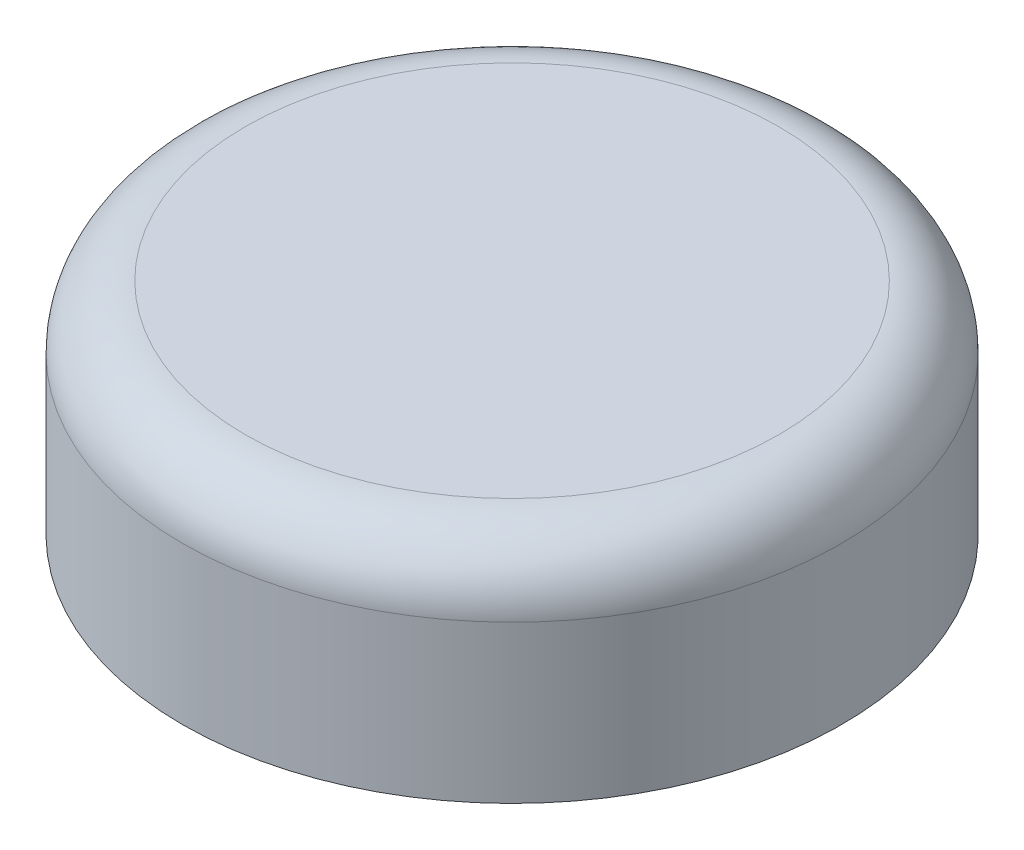
ISO-10303-21;
HEADER;
FILE_DESCRIPTION(('STEP AP214'),'2;1');
FILE_NAME('part.step','',(''),(''),'','','');
FILE_SCHEMA(('AUTOMOTIVE_DESIGN { 1 0 10303 214 1 1 1 1 }'));
ENDSEC;
DATA;
#1=APPLICATION_CONTEXT('core data for automotive mechanical design processes');
#2=APPLICATION_PROTOCOL_DEFINITION('international standard','automotive_design',2000,#1);
#3=PRODUCT_CONTEXT('',#1,'mechanical');
#4=PRODUCT('Part','Part','',(#3));
#5=PRODUCT_RELATED_PRODUCT_CATEGORY('part','',(#4));
#6=PRODUCT_DEFINITION_FORMATION('','',#4);
#7=PRODUCT_DEFINITION_CONTEXT('part definition',#1,'design');
#8=PRODUCT_DEFINITION('design','',#6,#7);
#9=PRODUCT_DEFINITION_SHAPE('','',#8);
#10=(LENGTH_UNIT() NAMED_UNIT(*) SI_UNIT(.MILLI.,.METRE.));
#11=(NAMED_UNIT(*) PLANE_ANGLE_UNIT() SI_UNIT($,.RADIAN.));
#12=(NAMED_UNIT(*) SI_UNIT($,.STERADIAN.) SOLID_ANGLE_UNIT());
#13=UNCERTAINTY_MEASURE_WITH_UNIT(LENGTH_MEASURE(1.E-05),#10,'distance_accuracy_value','');
#14=(GEOMETRIC_REPRESENTATION_CONTEXT(3) GLOBAL_UNCERTAINTY_ASSIGNED_CONTEXT((#13)) GLOBAL_UNIT_ASSIGNED_CONTEXT((#10,
#11,#12)) REPRESENTATION_CONTEXT('',''));
#15=CARTESIAN_POINT('',(0.,0.,0.));
#16=DIRECTION('',(0.,0.,1.));
#17=DIRECTION('',(1.,0.,0.));
#18=AXIS2_PLACEMENT_3D('',#15,#16,#17);
#19=CARTESIAN_POINT('',(0.,5.,0.));
#20=DIRECTION('',(0.,1.,0.));
#21=DIRECTION('',(0.,0.,1.));
#22=AXIS2_PLACEMENT_3D('',#19,#20,#21);
#23=TOROIDAL_SURFACE('',#22,8.5,2.);
#24=CARTESIAN_POINT('',(0.,7.,0.));
#25=DIRECTION('',(0.,1.,0.));
#26=DIRECTION('',(0.,0.,1.));
#27=AXIS2_PLACEMENT_3D('',#24,#25,#26);
#28=CIRCLE('',#27,8.5);
#29=CARTESIAN_POINT('',(0.,7.,8.5));
#30=VERTEX_POINT('',#29);
#31=EDGE_CURVE('E44',#30,#30,#28,.T.);
#32=ORIENTED_EDGE('',*,*,#31,.F.);
#33=EDGE_LOOP('',(#32));
#34=FACE_BOUND('',#33,.T.);
#35=CARTESIAN_POINT('',(0.,5.,0.));
#36=DIRECTION('',(0.,1.,0.));
#37=DIRECTION('',(0.,0.,1.));
#38=AXIS2_PLACEMENT_3D('',#35,#36,#37);
#39=CIRCLE('',#38,10.5);
#40=CARTESIAN_POINT('',(0.,5.,10.5));
#41=VERTEX_POINT('',#40);
#42=EDGE_CURVE('E10',#41,#41,#39,.F.);
#43=ORIENTED_EDGE('',*,*,#42,.F.);
#44=EDGE_LOOP('',(#43));
#45=FACE_BOUND('',#44,.T.);
#46=ADVANCED_FACE('F37',(#34,#45),#23,.T.);
#47=CARTESIAN_POINT('',(0.,7.,0.));
#48=DIRECTION('',(0.,-1.,0.));
#49=DIRECTION('',(0.,0.,-1.));
#50=AXIS2_PLACEMENT_3D('',#47,#48,#49);
#51=CYLINDRICAL_SURFACE('',#50,10.5);
#52=ORIENTED_EDGE('',*,*,#42,.T.);
#53=EDGE_LOOP('',(#52));
#54=FACE_BOUND('',#53,.T.);
#55=CARTESIAN_POINT('',(0.,0.,0.));
#56=DIRECTION('',(0.,1.,0.));
#57=DIRECTION('',(0.,0.,1.));
#58=AXIS2_PLACEMENT_3D('',#55,#56,#57);
#59=CIRCLE('',#58,10.5);
#60=CARTESIAN_POINT('',(0.,0.,10.5));
#61=VERTEX_POINT('',#60);
#62=EDGE_CURVE('E49',#61,#61,#59,.T.);
#63=ORIENTED_EDGE('',*,*,#62,.T.);
#64=EDGE_LOOP('',(#63));
#65=FACE_BOUND('',#64,.T.);
#66=ADVANCED_FACE('F57',(#54,#65),#51,.T.);
#67=CARTESIAN_POINT('',(0.,7.,0.));
#68=DIRECTION('',(0.,1.,0.));
#69=DIRECTION('',(0.,0.,1.));
#70=AXIS2_PLACEMENT_3D('',#67,#68,#69);
#71=PLANE('',#70);
#72=ORIENTED_EDGE('',*,*,#31,.T.);
#73=EDGE_LOOP('',(#72));
#74=FACE_BOUND('',#73,.T.);
#75=ADVANCED_FACE('F61',(#74),#71,.T.);
#76=CARTESIAN_POINT('',(0.,0.,0.));
#77=DIRECTION('',(0.,1.,0.));
#78=DIRECTION('',(0.,0.,1.));
#79=AXIS2_PLACEMENT_3D('',#76,#77,#78);
#80=PLANE('',#79);
#81=ORIENTED_EDGE('',*,*,#62,.F.);
#82=EDGE_LOOP('',(#81));
#83=FACE_BOUND('',#82,.T.);
#84=ADVANCED_FACE('F59',(#83),#80,.F.);
#85=CLOSED_SHELL('',(#46,#66,#75,#84));
#86=MANIFOLD_SOLID_BREP('B2',#85);
#87=ADVANCED_BREP_SHAPE_REPRESENTATION('',(#18,#86),#14);
#88=SHAPE_DEFINITION_REPRESENTATION(#9,#87);
ENDSEC;
END-ISO-10303-21;
